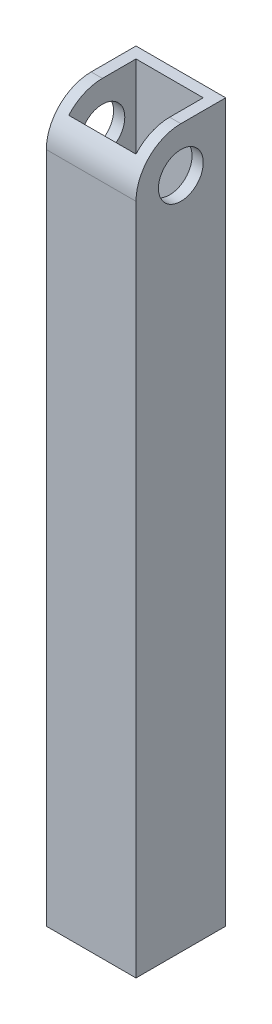
ISO-10303-21;
HEADER;
FILE_DESCRIPTION(('STEP AP214'),'2;1');
FILE_NAME('part.step','',(''),(''),'','','');
FILE_SCHEMA(('AUTOMOTIVE_DESIGN { 1 0 10303 214 1 1 1 1 }'));
ENDSEC;
DATA;
#1=APPLICATION_CONTEXT('core data for automotive mechanical design processes');
#2=APPLICATION_PROTOCOL_DEFINITION('international standard','automotive_design',2000,#1);
#3=PRODUCT_CONTEXT('',#1,'mechanical');
#4=PRODUCT('Part','Part','',(#3));
#5=PRODUCT_RELATED_PRODUCT_CATEGORY('part','',(#4));
#6=PRODUCT_DEFINITION_FORMATION('','',#4);
#7=PRODUCT_DEFINITION_CONTEXT('part definition',#1,'design');
#8=PRODUCT_DEFINITION('design','',#6,#7);
#9=PRODUCT_DEFINITION_SHAPE('','',#8);
#10=(LENGTH_UNIT() NAMED_UNIT(*) SI_UNIT(.MILLI.,.METRE.));
#11=(NAMED_UNIT(*) PLANE_ANGLE_UNIT() SI_UNIT($,.RADIAN.));
#12=(NAMED_UNIT(*) SI_UNIT($,.STERADIAN.) SOLID_ANGLE_UNIT());
#13=UNCERTAINTY_MEASURE_WITH_UNIT(LENGTH_MEASURE(1.E-05),#10,'distance_accuracy_value','');
#14=(GEOMETRIC_REPRESENTATION_CONTEXT(3) GLOBAL_UNCERTAINTY_ASSIGNED_CONTEXT((#13)) GLOBAL_UNIT_ASSIGNED_CONTEXT((#10,
#11,#12)) REPRESENTATION_CONTEXT('',''));
#15=CARTESIAN_POINT('',(0.,0.,0.));
#16=DIRECTION('',(0.,0.,1.));
#17=DIRECTION('',(1.,0.,0.));
#18=AXIS2_PLACEMENT_3D('',#15,#16,#17);
#19=CARTESIAN_POINT('',(0.,203.2,0.));
#20=DIRECTION('',(0.,1.,0.));
#21=DIRECTION('',(0.,0.,1.));
#22=AXIS2_PLACEMENT_3D('',#19,#20,#21);
#23=PLANE('',#22);
#24=DIRECTION('',(1.,0.,0.));
#25=VECTOR('',#24,1.);
#26=CARTESIAN_POINT('',(-12.7,203.2,0.));
#27=LINE('',#26,#25);
#28=CARTESIAN_POINT('',(9.525,203.2,0.));
#29=VERTEX_POINT('',#28);
#30=CARTESIAN_POINT('',(12.7,203.2,0.));
#31=VERTEX_POINT('',#30);
#32=EDGE_CURVE('E151',#29,#31,#27,.T.);
#33=ORIENTED_EDGE('',*,*,#32,.T.);
#34=DIRECTION('',(0.,0.,-1.));
#35=VECTOR('',#34,1.);
#36=CARTESIAN_POINT('',(12.7,203.2,12.7));
#37=LINE('',#36,#35);
#38=CARTESIAN_POINT('',(12.7,203.2,-12.7));
#39=VERTEX_POINT('',#38);
#40=EDGE_CURVE('E174',#31,#39,#37,.T.);
#41=ORIENTED_EDGE('',*,*,#40,.T.);
#42=DIRECTION('',(-1.,0.,0.));
#43=VECTOR('',#42,1.);
#44=CARTESIAN_POINT('',(-12.7,203.2,-12.7));
#45=LINE('',#44,#43);
#46=CARTESIAN_POINT('',(-12.7,203.2,-12.7));
#47=VERTEX_POINT('',#46);
#48=EDGE_CURVE('E166',#39,#47,#45,.T.);
#49=ORIENTED_EDGE('',*,*,#48,.T.);
#50=DIRECTION('',(0.,0.,1.));
#51=VECTOR('',#50,1.);
#52=CARTESIAN_POINT('',(-12.7,203.2,12.7));
#53=LINE('',#52,#51);
#54=CARTESIAN_POINT('',(-12.7,203.2,0.));
#55=VERTEX_POINT('',#54);
#56=EDGE_CURVE('E158',#47,#55,#53,.T.);
#57=ORIENTED_EDGE('',*,*,#56,.T.);
#58=CARTESIAN_POINT('',(-9.525,203.2,0.));
#59=VERTEX_POINT('',#58);
#60=EDGE_CURVE('E138',#55,#59,#27,.T.);
#61=ORIENTED_EDGE('',*,*,#60,.T.);
#62=DIRECTION('',(0.,0.,1.));
#63=VECTOR('',#62,1.);
#64=CARTESIAN_POINT('',(-9.525,203.2,0.));
#65=LINE('',#64,#63);
#66=CARTESIAN_POINT('',(-9.525,203.2,-9.525));
#67=VERTEX_POINT('',#66);
#68=EDGE_CURVE('E230',#67,#59,#65,.T.);
#69=ORIENTED_EDGE('',*,*,#68,.F.);
#70=DIRECTION('',(-1.,0.,0.));
#71=VECTOR('',#70,1.);
#72=CARTESIAN_POINT('',(0.,203.2,-9.525));
#73=LINE('',#72,#71);
#74=CARTESIAN_POINT('',(9.525,203.2,-9.525));
#75=VERTEX_POINT('',#74);
#76=EDGE_CURVE('E226',#75,#67,#73,.T.);
#77=ORIENTED_EDGE('',*,*,#76,.F.);
#78=DIRECTION('',(0.,0.,-1.));
#79=VECTOR('',#78,1.);
#80=CARTESIAN_POINT('',(9.525,203.2,0.));
#81=LINE('',#80,#79);
#82=EDGE_CURVE('E223',#29,#75,#81,.T.);
#83=ORIENTED_EDGE('',*,*,#82,.F.);
#84=EDGE_LOOP('',(#33,#41,#49,#57,#61,#69,#77,#83));
#85=FACE_BOUND('',#84,.T.);
#86=ADVANCED_FACE('F62',(#85),#23,.T.);
#87=CARTESIAN_POINT('',(0.,0.,0.));
#88=DIRECTION('',(0.,1.,0.));
#89=DIRECTION('',(0.,0.,1.));
#90=AXIS2_PLACEMENT_3D('',#87,#88,#89);
#91=PLANE('',#90);
#92=DIRECTION('',(0.,0.,-1.));
#93=VECTOR('',#92,1.);
#94=CARTESIAN_POINT('',(12.7,0.,12.7));
#95=LINE('',#94,#93);
#96=CARTESIAN_POINT('',(12.7,0.,12.7));
#97=VERTEX_POINT('',#96);
#98=CARTESIAN_POINT('',(12.7,0.,-12.7));
#99=VERTEX_POINT('',#98);
#100=EDGE_CURVE('E178',#97,#99,#95,.T.);
#101=ORIENTED_EDGE('',*,*,#100,.F.);
#102=DIRECTION('',(1.,0.,0.));
#103=VECTOR('',#102,1.);
#104=CARTESIAN_POINT('',(-12.7,0.,12.7));
#105=LINE('',#104,#103);
#106=CARTESIAN_POINT('',(-12.7,0.,12.7));
#107=VERTEX_POINT('',#106);
#108=EDGE_CURVE('E189',#107,#97,#105,.T.);
#109=ORIENTED_EDGE('',*,*,#108,.F.);
#110=DIRECTION('',(0.,0.,1.));
#111=VECTOR('',#110,1.);
#112=CARTESIAN_POINT('',(-12.7,0.,12.7));
#113=LINE('',#112,#111);
#114=CARTESIAN_POINT('',(-12.7,0.,-12.7));
#115=VERTEX_POINT('',#114);
#116=EDGE_CURVE('E186',#115,#107,#113,.T.);
#117=ORIENTED_EDGE('',*,*,#116,.F.);
#118=DIRECTION('',(-1.,0.,0.));
#119=VECTOR('',#118,1.);
#120=CARTESIAN_POINT('',(-12.7,0.,-12.7));
#121=LINE('',#120,#119);
#122=EDGE_CURVE('E182',#99,#115,#121,.T.);
#123=ORIENTED_EDGE('',*,*,#122,.F.);
#124=EDGE_LOOP('',(#101,#109,#117,#123));
#125=FACE_BOUND('',#124,.T.);
#126=DIRECTION('',(0.,0.,-1.));
#127=VECTOR('',#126,1.);
#128=CARTESIAN_POINT('',(9.525,0.,0.));
#129=LINE('',#128,#127);
#130=CARTESIAN_POINT('',(9.525,0.,9.525));
#131=VERTEX_POINT('',#130);
#132=CARTESIAN_POINT('',(9.525,0.,-9.525));
#133=VERTEX_POINT('',#132);
#134=EDGE_CURVE('E210',#131,#133,#129,.T.);
#135=ORIENTED_EDGE('',*,*,#134,.T.);
#136=DIRECTION('',(-1.,0.,0.));
#137=VECTOR('',#136,1.);
#138=CARTESIAN_POINT('',(0.,0.,-9.525));
#139=LINE('',#138,#137);
#140=CARTESIAN_POINT('',(-9.525,0.,-9.525));
#141=VERTEX_POINT('',#140);
#142=EDGE_CURVE('E236',#133,#141,#139,.T.);
#143=ORIENTED_EDGE('',*,*,#142,.T.);
#144=DIRECTION('',(0.,0.,1.));
#145=VECTOR('',#144,1.);
#146=CARTESIAN_POINT('',(-9.525,0.,0.));
#147=LINE('',#146,#145);
#148=CARTESIAN_POINT('',(-9.525,0.,9.525));
#149=VERTEX_POINT('',#148);
#150=EDGE_CURVE('E240',#141,#149,#147,.T.);
#151=ORIENTED_EDGE('',*,*,#150,.T.);
#152=DIRECTION('',(1.,0.,0.));
#153=VECTOR('',#152,1.);
#154=CARTESIAN_POINT('',(0.,0.,9.525));
#155=LINE('',#154,#153);
#156=EDGE_CURVE('E227',#149,#131,#155,.T.);
#157=ORIENTED_EDGE('',*,*,#156,.T.);
#158=EDGE_LOOP('',(#135,#143,#151,#157));
#159=FACE_BOUND('',#158,.T.);
#160=ADVANCED_FACE('F269',(#125,#159),#91,.F.);
#161=CARTESIAN_POINT('',(12.7,203.2,12.7));
#162=DIRECTION('',(-1.,0.,0.));
#163=DIRECTION('',(0.,0.,1.));
#164=AXIS2_PLACEMENT_3D('',#161,#162,#163);
#165=PLANE('',#164);
#166=CARTESIAN_POINT('',(12.7,190.5,0.));
#167=DIRECTION('',(1.,0.,0.));
#168=DIRECTION('',(0.,0.,-1.));
#169=AXIS2_PLACEMENT_3D('',#166,#167,#168);
#170=CIRCLE('',#169,6.34999999999999);
#171=CARTESIAN_POINT('',(12.7,190.5,-6.34999999999999));
#172=VERTEX_POINT('',#171);
#173=EDGE_CURVE('E213',#172,#172,#170,.T.);
#174=ORIENTED_EDGE('',*,*,#173,.F.);
#175=EDGE_LOOP('',(#174));
#176=FACE_BOUND('',#175,.T.);
#177=ORIENTED_EDGE('',*,*,#40,.F.);
#178=CARTESIAN_POINT('',(12.7,190.5,0.));
#179=DIRECTION('',(-1.,0.,0.));
#180=DIRECTION('',(0.,0.,-1.));
#181=AXIS2_PLACEMENT_3D('',#178,#179,#180);
#182=CIRCLE('',#181,12.7);
#183=CARTESIAN_POINT('',(12.7,190.5,12.7));
#184=VERTEX_POINT('',#183);
#185=EDGE_CURVE('E162',#184,#31,#182,.T.);
#186=ORIENTED_EDGE('',*,*,#185,.F.);
#187=DIRECTION('',(0.,-1.,0.));
#188=VECTOR('',#187,1.);
#189=CARTESIAN_POINT('',(12.7,203.2,12.7));
#190=LINE('',#189,#188);
#191=EDGE_CURVE('E169',#184,#97,#190,.T.);
#192=ORIENTED_EDGE('',*,*,#191,.T.);
#193=ORIENTED_EDGE('',*,*,#100,.T.);
#194=DIRECTION('',(0.,-1.,0.));
#195=VECTOR('',#194,1.);
#196=CARTESIAN_POINT('',(12.7,203.2,-12.7));
#197=LINE('',#196,#195);
#198=EDGE_CURVE('E71',#39,#99,#197,.T.);
#199=ORIENTED_EDGE('',*,*,#198,.F.);
#200=EDGE_LOOP('',(#177,#186,#192,#193,#199));
#201=FACE_BOUND('',#200,.T.);
#202=ADVANCED_FACE('F64',(#176,#201),#165,.F.);
#203=CARTESIAN_POINT('',(-12.7,203.2,-12.7));
#204=DIRECTION('',(0.,0.,1.));
#205=DIRECTION('',(1.,0.,0.));
#206=AXIS2_PLACEMENT_3D('',#203,#204,#205);
#207=PLANE('',#206);
#208=ORIENTED_EDGE('',*,*,#122,.T.);
#209=DIRECTION('',(0.,-1.,0.));
#210=VECTOR('',#209,1.);
#211=CARTESIAN_POINT('',(-12.7,203.2,-12.7));
#212=LINE('',#211,#210);
#213=EDGE_CURVE('E195',#47,#115,#212,.T.);
#214=ORIENTED_EDGE('',*,*,#213,.F.);
#215=ORIENTED_EDGE('',*,*,#48,.F.);
#216=ORIENTED_EDGE('',*,*,#198,.T.);
#217=EDGE_LOOP('',(#208,#214,#215,#216));
#218=FACE_BOUND('',#217,.T.);
#219=ADVANCED_FACE('F264',(#218),#207,.F.);
#220=CARTESIAN_POINT('',(-12.7,203.2,12.7));
#221=DIRECTION('',(1.,0.,0.));
#222=DIRECTION('',(0.,0.,-1.));
#223=AXIS2_PLACEMENT_3D('',#220,#221,#222);
#224=PLANE('',#223);
#225=CARTESIAN_POINT('',(-12.7,190.5,0.));
#226=DIRECTION('',(1.,0.,0.));
#227=DIRECTION('',(0.,0.,-1.));
#228=AXIS2_PLACEMENT_3D('',#225,#226,#227);
#229=CIRCLE('',#228,6.34999999999999);
#230=CARTESIAN_POINT('',(-12.7,190.5,-6.34999999999999));
#231=VERTEX_POINT('',#230);
#232=EDGE_CURVE('E204',#231,#231,#229,.T.);
#233=ORIENTED_EDGE('',*,*,#232,.T.);
#234=EDGE_LOOP('',(#233));
#235=FACE_BOUND('',#234,.T.);
#236=DIRECTION('',(0.,-1.,0.));
#237=VECTOR('',#236,1.);
#238=CARTESIAN_POINT('',(-12.7,203.2,12.7));
#239=LINE('',#238,#237);
#240=CARTESIAN_POINT('',(-12.7,190.5,12.7));
#241=VERTEX_POINT('',#240);
#242=EDGE_CURVE('E160',#241,#107,#239,.T.);
#243=ORIENTED_EDGE('',*,*,#242,.F.);
#244=CARTESIAN_POINT('',(-12.7,190.5,0.));
#245=DIRECTION('',(-1.,0.,0.));
#246=DIRECTION('',(0.,0.,-1.));
#247=AXIS2_PLACEMENT_3D('',#244,#245,#246);
#248=CIRCLE('',#247,12.7);
#249=EDGE_CURVE('E141',#241,#55,#248,.T.);
#250=ORIENTED_EDGE('',*,*,#249,.T.);
#251=ORIENTED_EDGE('',*,*,#56,.F.);
#252=ORIENTED_EDGE('',*,*,#213,.T.);
#253=ORIENTED_EDGE('',*,*,#116,.T.);
#254=EDGE_LOOP('',(#243,#250,#251,#252,#253));
#255=FACE_BOUND('',#254,.T.);
#256=ADVANCED_FACE('F156',(#235,#255),#224,.F.);
#257=CARTESIAN_POINT('',(-12.7,203.2,12.7));
#258=DIRECTION('',(0.,0.,-1.));
#259=DIRECTION('',(-1.,0.,0.));
#260=AXIS2_PLACEMENT_3D('',#257,#258,#259);
#261=PLANE('',#260);
#262=ORIENTED_EDGE('',*,*,#191,.F.);
#263=DIRECTION('',(1.,0.,0.));
#264=VECTOR('',#263,1.);
#265=CARTESIAN_POINT('',(-12.7,190.5,12.7));
#266=LINE('',#265,#264);
#267=EDGE_CURVE('E150',#241,#184,#266,.T.);
#268=ORIENTED_EDGE('',*,*,#267,.F.);
#269=ORIENTED_EDGE('',*,*,#242,.T.);
#270=ORIENTED_EDGE('',*,*,#108,.T.);
#271=EDGE_LOOP('',(#262,#268,#269,#270));
#272=FACE_BOUND('',#271,.T.);
#273=ADVANCED_FACE('F273',(#272),#261,.F.);
#274=CARTESIAN_POINT('',(9.525,203.2,0.));
#275=DIRECTION('',(-1.,0.,0.));
#276=DIRECTION('',(0.,0.,1.));
#277=AXIS2_PLACEMENT_3D('',#274,#275,#276);
#278=PLANE('',#277);
#279=CARTESIAN_POINT('',(9.525,190.5,0.));
#280=DIRECTION('',(-1.,0.,0.));
#281=DIRECTION('',(0.,0.,1.));
#282=AXIS2_PLACEMENT_3D('',#279,#280,#281);
#283=CIRCLE('',#282,12.7);
#284=CARTESIAN_POINT('',(9.525,198.90026041263,9.525));
#285=VERTEX_POINT('',#284);
#286=EDGE_CURVE('E77',#29,#285,#283,.F.);
#287=ORIENTED_EDGE('',*,*,#286,.F.);
#288=ORIENTED_EDGE('',*,*,#82,.T.);
#289=DIRECTION('',(0.,-1.,0.));
#290=VECTOR('',#289,1.);
#291=CARTESIAN_POINT('',(9.525,203.2,-9.525));
#292=LINE('',#291,#290);
#293=EDGE_CURVE('E183',#75,#133,#292,.T.);
#294=ORIENTED_EDGE('',*,*,#293,.T.);
#295=ORIENTED_EDGE('',*,*,#134,.F.);
#296=DIRECTION('',(0.,-1.,0.));
#297=VECTOR('',#296,1.);
#298=CARTESIAN_POINT('',(9.525,203.2,9.525));
#299=LINE('',#298,#297);
#300=EDGE_CURVE('E84',#285,#131,#299,.T.);
#301=ORIENTED_EDGE('',*,*,#300,.F.);
#302=EDGE_LOOP('',(#287,#288,#294,#295,#301));
#303=FACE_BOUND('',#302,.T.);
#304=CARTESIAN_POINT('',(9.525,190.5,0.));
#305=DIRECTION('',(-1.,0.,0.));
#306=DIRECTION('',(0.,0.,1.));
#307=AXIS2_PLACEMENT_3D('',#304,#305,#306);
#308=CIRCLE('',#307,6.34999999999999);
#309=CARTESIAN_POINT('',(9.525,190.5,6.34999999999999));
#310=VERTEX_POINT('',#309);
#311=EDGE_CURVE('E203',#310,#310,#308,.T.);
#312=ORIENTED_EDGE('',*,*,#311,.F.);
#313=EDGE_LOOP('',(#312));
#314=FACE_BOUND('',#313,.T.);
#315=ADVANCED_FACE('F281',(#303,#314),#278,.T.);
#316=CARTESIAN_POINT('',(0.,203.2,-9.525));
#317=DIRECTION('',(0.,0.,1.));
#318=DIRECTION('',(1.,0.,0.));
#319=AXIS2_PLACEMENT_3D('',#316,#317,#318);
#320=PLANE('',#319);
#321=ORIENTED_EDGE('',*,*,#142,.F.);
#322=ORIENTED_EDGE('',*,*,#293,.F.);
#323=ORIENTED_EDGE('',*,*,#76,.T.);
#324=DIRECTION('',(0.,-1.,0.));
#325=VECTOR('',#324,1.);
#326=CARTESIAN_POINT('',(-9.525,203.2,-9.525));
#327=LINE('',#326,#325);
#328=EDGE_CURVE('E252',#67,#141,#327,.T.);
#329=ORIENTED_EDGE('',*,*,#328,.T.);
#330=EDGE_LOOP('',(#321,#322,#323,#329));
#331=FACE_BOUND('',#330,.T.);
#332=ADVANCED_FACE('F288',(#331),#320,.T.);
#333=CARTESIAN_POINT('',(-9.525,203.2,0.));
#334=DIRECTION('',(1.,0.,0.));
#335=DIRECTION('',(0.,0.,-1.));
#336=AXIS2_PLACEMENT_3D('',#333,#334,#335);
#337=PLANE('',#336);
#338=CARTESIAN_POINT('',(-9.525,190.5,0.));
#339=DIRECTION('',(1.,0.,0.));
#340=DIRECTION('',(0.,0.,-1.));
#341=AXIS2_PLACEMENT_3D('',#338,#339,#340);
#342=CIRCLE('',#341,12.7);
#343=CARTESIAN_POINT('',(-9.525,198.90026041263,9.525));
#344=VERTEX_POINT('',#343);
#345=EDGE_CURVE('E144',#344,#59,#342,.F.);
#346=ORIENTED_EDGE('',*,*,#345,.F.);
#347=DIRECTION('',(0.,-1.,0.));
#348=VECTOR('',#347,1.);
#349=CARTESIAN_POINT('',(-9.525,203.2,9.525));
#350=LINE('',#349,#348);
#351=EDGE_CURVE('E249',#344,#149,#350,.T.);
#352=ORIENTED_EDGE('',*,*,#351,.T.);
#353=ORIENTED_EDGE('',*,*,#150,.F.);
#354=ORIENTED_EDGE('',*,*,#328,.F.);
#355=ORIENTED_EDGE('',*,*,#68,.T.);
#356=EDGE_LOOP('',(#346,#352,#353,#354,#355));
#357=FACE_BOUND('',#356,.T.);
#358=CARTESIAN_POINT('',(-9.525,190.5,0.));
#359=DIRECTION('',(1.,0.,0.));
#360=DIRECTION('',(0.,0.,-1.));
#361=AXIS2_PLACEMENT_3D('',#358,#359,#360);
#362=CIRCLE('',#361,6.34999999999999);
#363=CARTESIAN_POINT('',(-9.525,190.5,-6.34999999999999));
#364=VERTEX_POINT('',#363);
#365=EDGE_CURVE('E200',#364,#364,#362,.T.);
#366=ORIENTED_EDGE('',*,*,#365,.F.);
#367=EDGE_LOOP('',(#366));
#368=FACE_BOUND('',#367,.T.);
#369=ADVANCED_FACE('F291',(#357,#368),#337,.T.);
#370=CARTESIAN_POINT('',(0.,203.2,9.525));
#371=DIRECTION('',(0.,0.,-1.));
#372=DIRECTION('',(-1.,0.,0.));
#373=AXIS2_PLACEMENT_3D('',#370,#371,#372);
#374=PLANE('',#373);
#375=DIRECTION('',(1.,0.,0.));
#376=VECTOR('',#375,1.);
#377=CARTESIAN_POINT('',(-12.7,198.90026041263,9.525));
#378=LINE('',#377,#376);
#379=EDGE_CURVE('E12',#285,#344,#378,.F.);
#380=ORIENTED_EDGE('',*,*,#379,.F.);
#381=ORIENTED_EDGE('',*,*,#300,.T.);
#382=ORIENTED_EDGE('',*,*,#156,.F.);
#383=ORIENTED_EDGE('',*,*,#351,.F.);
#384=EDGE_LOOP('',(#380,#381,#382,#383));
#385=FACE_BOUND('',#384,.T.);
#386=ADVANCED_FACE('F294',(#385),#374,.T.);
#387=CARTESIAN_POINT('',(-12.7,190.5,0.));
#388=DIRECTION('',(1.,0.,0.));
#389=DIRECTION('',(0.,0.,-1.));
#390=AXIS2_PLACEMENT_3D('',#387,#388,#389);
#391=CYLINDRICAL_SURFACE('',#390,6.34999999999999);
#392=ORIENTED_EDGE('',*,*,#365,.T.);
#393=EDGE_LOOP('',(#392));
#394=FACE_BOUND('',#393,.T.);
#395=ORIENTED_EDGE('',*,*,#232,.F.);
#396=EDGE_LOOP('',(#395));
#397=FACE_BOUND('',#396,.T.);
#398=ADVANCED_FACE('F296',(#394,#397),#391,.F.);
#399=ORIENTED_EDGE('',*,*,#311,.T.);
#400=EDGE_LOOP('',(#399));
#401=FACE_BOUND('',#400,.T.);
#402=ORIENTED_EDGE('',*,*,#173,.T.);
#403=EDGE_LOOP('',(#402));
#404=FACE_BOUND('',#403,.T.);
#405=ADVANCED_FACE('F302',(#401,#404),#391,.F.);
#406=CARTESIAN_POINT('',(-12.7,190.5,0.));
#407=DIRECTION('',(1.,0.,0.));
#408=DIRECTION('',(0.,0.,-1.));
#409=AXIS2_PLACEMENT_3D('',#406,#407,#408);
#410=CYLINDRICAL_SURFACE('',#409,12.7);
#411=ORIENTED_EDGE('',*,*,#286,.T.);
#412=ORIENTED_EDGE('',*,*,#379,.T.);
#413=ORIENTED_EDGE('',*,*,#345,.T.);
#414=ORIENTED_EDGE('',*,*,#60,.F.);
#415=ORIENTED_EDGE('',*,*,#249,.F.);
#416=ORIENTED_EDGE('',*,*,#267,.T.);
#417=ORIENTED_EDGE('',*,*,#185,.T.);
#418=ORIENTED_EDGE('',*,*,#32,.F.);
#419=EDGE_LOOP('',(#411,#412,#413,#414,#415,#416,#417,#418));
#420=FACE_BOUND('',#419,.T.);
#421=ADVANCED_FACE('F140',(#420),#410,.T.);
#422=CLOSED_SHELL('',(#86,#160,#202,#219,#256,#273,#315,#332,#369,#386,#398,#405,#421));
#423=MANIFOLD_SOLID_BREP('B2',#422);
#424=ADVANCED_BREP_SHAPE_REPRESENTATION('',(#18,#423),#14);
#425=SHAPE_DEFINITION_REPRESENTATION(#9,#424);
ENDSEC;
END-ISO-10303-21;
